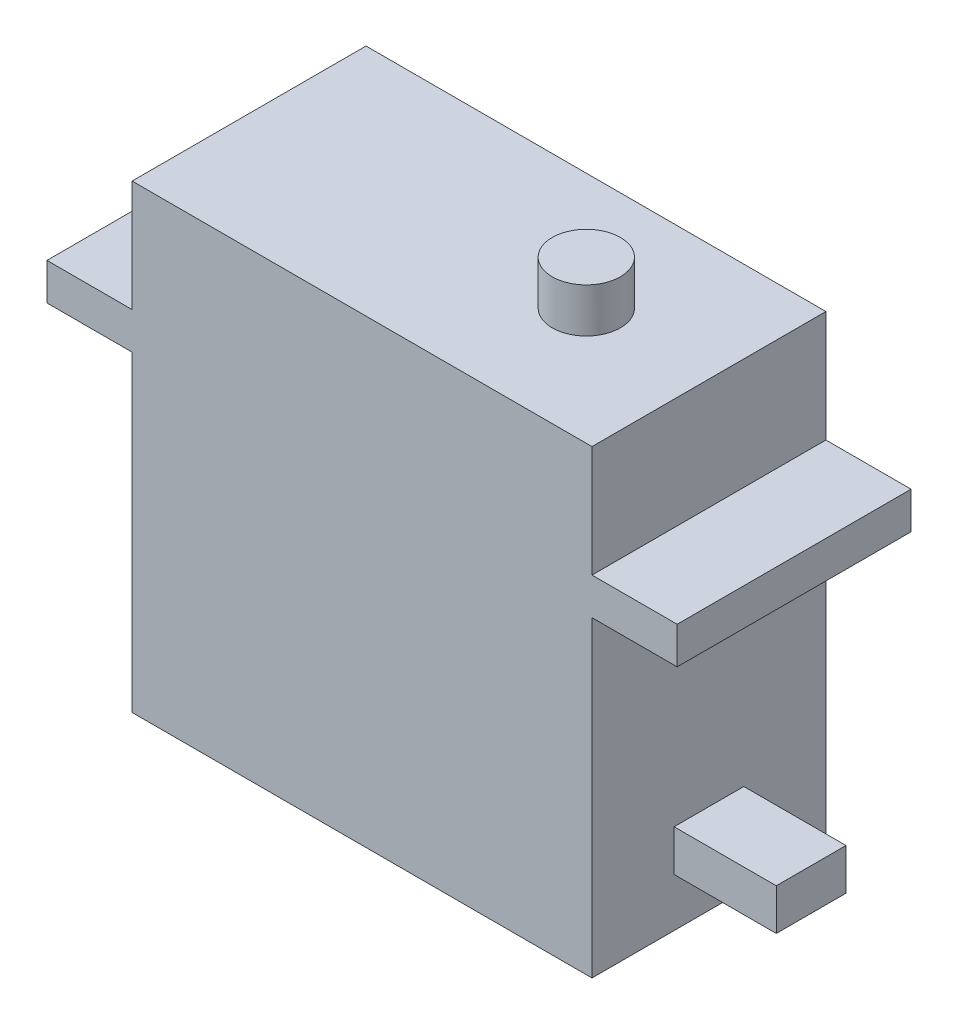
ISO-10303-21;
HEADER;
FILE_DESCRIPTION(('STEP AP214'),'2;1');
FILE_NAME('part.step','',(''),(''),'','','');
FILE_SCHEMA(('AUTOMOTIVE_DESIGN { 1 0 10303 214 1 1 1 1 }'));
ENDSEC;
DATA;
#1=APPLICATION_CONTEXT('core data for automotive mechanical design processes');
#2=APPLICATION_PROTOCOL_DEFINITION('international standard','automotive_design',2000,#1);
#3=PRODUCT_CONTEXT('',#1,'mechanical');
#4=PRODUCT('Part','Part','',(#3));
#5=PRODUCT_RELATED_PRODUCT_CATEGORY('part','',(#4));
#6=PRODUCT_DEFINITION_FORMATION('','',#4);
#7=PRODUCT_DEFINITION_CONTEXT('part definition',#1,'design');
#8=PRODUCT_DEFINITION('design','',#6,#7);
#9=PRODUCT_DEFINITION_SHAPE('','',#8);
#10=(LENGTH_UNIT() NAMED_UNIT(*) SI_UNIT(.MILLI.,.METRE.));
#11=(NAMED_UNIT(*) PLANE_ANGLE_UNIT() SI_UNIT($,.RADIAN.));
#12=(NAMED_UNIT(*) SI_UNIT($,.STERADIAN.) SOLID_ANGLE_UNIT());
#13=UNCERTAINTY_MEASURE_WITH_UNIT(LENGTH_MEASURE(1.E-05),#10,'distance_accuracy_value','');
#14=(GEOMETRIC_REPRESENTATION_CONTEXT(3) GLOBAL_UNCERTAINTY_ASSIGNED_CONTEXT((#13)) GLOBAL_UNIT_ASSIGNED_CONTEXT((#10,
#11,#12)) REPRESENTATION_CONTEXT('',''));
#15=CARTESIAN_POINT('',(0.,0.,0.));
#16=DIRECTION('',(0.,0.,1.));
#17=DIRECTION('',(1.,0.,0.));
#18=AXIS2_PLACEMENT_3D('',#15,#16,#17);
#19=CARTESIAN_POINT('',(20.25,-20.265,20.6));
#20=DIRECTION('',(-1.,0.,0.));
#21=DIRECTION('',(0.,0.,1.));
#22=AXIS2_PLACEMENT_3D('',#19,#20,#21);
#23=PLANE('',#22);
#24=DIRECTION('',(0.,1.,0.));
#25=VECTOR('',#24,1.);
#26=CARTESIAN_POINT('',(20.25,-20.265,0.));
#27=LINE('',#26,#25);
#28=CARTESIAN_POINT('',(20.25,-20.265,0.));
#29=VERTEX_POINT('',#28);
#30=CARTESIAN_POINT('',(20.25,7.215,0.));
#31=VERTEX_POINT('',#30);
#32=EDGE_CURVE('E248',#29,#31,#27,.T.);
#33=ORIENTED_EDGE('',*,*,#32,.T.);
#34=DIRECTION('',(0.,0.,1.));
#35=VECTOR('',#34,1.);
#36=CARTESIAN_POINT('',(20.25,7.215,20.6));
#37=LINE('',#36,#35);
#38=CARTESIAN_POINT('',(20.25,7.215,20.6));
#39=VERTEX_POINT('',#38);
#40=EDGE_CURVE('E188',#31,#39,#37,.T.);
#41=ORIENTED_EDGE('',*,*,#40,.T.);
#42=DIRECTION('',(0.,1.,0.));
#43=VECTOR('',#42,1.);
#44=CARTESIAN_POINT('',(20.25,-20.265,20.6));
#45=LINE('',#44,#43);
#46=CARTESIAN_POINT('',(20.25,-20.265,20.6));
#47=VERTEX_POINT('',#46);
#48=EDGE_CURVE('E235',#47,#39,#45,.T.);
#49=ORIENTED_EDGE('',*,*,#48,.F.);
#50=DIRECTION('',(0.,0.,-1.));
#51=VECTOR('',#50,1.);
#52=CARTESIAN_POINT('',(20.25,-20.265,20.6));
#53=LINE('',#52,#51);
#54=EDGE_CURVE('E247',#47,#29,#53,.T.);
#55=ORIENTED_EDGE('',*,*,#54,.T.);
#56=EDGE_LOOP('',(#33,#41,#49,#55));
#57=FACE_BOUND('',#56,.T.);
#58=DIRECTION('',(0.,1.,0.));
#59=VECTOR('',#58,1.);
#60=CARTESIAN_POINT('',(20.25,-15.985,7.23));
#61=LINE('',#60,#59);
#62=CARTESIAN_POINT('',(20.25,-15.985,7.23));
#63=VERTEX_POINT('',#62);
#64=CARTESIAN_POINT('',(20.25,-12.345,7.23));
#65=VERTEX_POINT('',#64);
#66=EDGE_CURVE('E171',#63,#65,#61,.T.);
#67=ORIENTED_EDGE('',*,*,#66,.F.);
#68=DIRECTION('',(0.,0.,-1.));
#69=VECTOR('',#68,1.);
#70=CARTESIAN_POINT('',(20.25,-15.985,13.37));
#71=LINE('',#70,#69);
#72=CARTESIAN_POINT('',(20.25,-15.985,13.37));
#73=VERTEX_POINT('',#72);
#74=EDGE_CURVE('E168',#73,#63,#71,.T.);
#75=ORIENTED_EDGE('',*,*,#74,.F.);
#76=DIRECTION('',(0.,-1.,0.));
#77=VECTOR('',#76,1.);
#78=CARTESIAN_POINT('',(20.25,-15.985,13.37));
#79=LINE('',#78,#77);
#80=CARTESIAN_POINT('',(20.25,-12.345,13.37));
#81=VERTEX_POINT('',#80);
#82=EDGE_CURVE('E58',#81,#73,#79,.T.);
#83=ORIENTED_EDGE('',*,*,#82,.F.);
#84=DIRECTION('',(0.,0.,1.));
#85=VECTOR('',#84,1.);
#86=CARTESIAN_POINT('',(20.25,-12.345,13.37));
#87=LINE('',#86,#85);
#88=EDGE_CURVE('E53',#65,#81,#87,.T.);
#89=ORIENTED_EDGE('',*,*,#88,.F.);
#90=EDGE_LOOP('',(#67,#75,#83,#89));
#91=FACE_BOUND('',#90,.T.);
#92=ADVANCED_FACE('F39',(#57,#91),#23,.F.);
#93=DIRECTION('',(0.,0.,1.));
#94=VECTOR('',#93,1.);
#95=CARTESIAN_POINT('',(20.25,10.465,20.6));
#96=LINE('',#95,#94);
#97=CARTESIAN_POINT('',(20.25,10.465,0.));
#98=VERTEX_POINT('',#97);
#99=CARTESIAN_POINT('',(20.25,10.465,20.6));
#100=VERTEX_POINT('',#99);
#101=EDGE_CURVE('E194',#98,#100,#96,.T.);
#102=ORIENTED_EDGE('',*,*,#101,.F.);
#103=CARTESIAN_POINT('',(20.25,20.265,0.));
#104=VERTEX_POINT('',#103);
#105=EDGE_CURVE('E233',#98,#104,#27,.T.);
#106=ORIENTED_EDGE('',*,*,#105,.T.);
#107=DIRECTION('',(0.,0.,-1.));
#108=VECTOR('',#107,1.);
#109=CARTESIAN_POINT('',(20.25,20.265,20.6));
#110=LINE('',#109,#108);
#111=CARTESIAN_POINT('',(20.25,20.265,20.6));
#112=VERTEX_POINT('',#111);
#113=EDGE_CURVE('E46',#112,#104,#110,.T.);
#114=ORIENTED_EDGE('',*,*,#113,.F.);
#115=EDGE_CURVE('E239',#100,#112,#45,.T.);
#116=ORIENTED_EDGE('',*,*,#115,.F.);
#117=EDGE_LOOP('',(#102,#106,#114,#116));
#118=FACE_BOUND('',#117,.T.);
#119=ADVANCED_FACE('F276',(#118),#23,.F.);
#120=CARTESIAN_POINT('',(-20.25,-20.265,20.6));
#121=DIRECTION('',(1.,0.,0.));
#122=DIRECTION('',(0.,0.,-1.));
#123=AXIS2_PLACEMENT_3D('',#120,#121,#122);
#124=PLANE('',#123);
#125=DIRECTION('',(0.,0.,-1.));
#126=VECTOR('',#125,1.);
#127=CARTESIAN_POINT('',(-20.25,10.465,20.6));
#128=LINE('',#127,#126);
#129=CARTESIAN_POINT('',(-20.25,10.465,20.6));
#130=VERTEX_POINT('',#129);
#131=CARTESIAN_POINT('',(-20.25,10.465,0.));
#132=VERTEX_POINT('',#131);
#133=EDGE_CURVE('E197',#130,#132,#128,.T.);
#134=ORIENTED_EDGE('',*,*,#133,.F.);
#135=DIRECTION('',(0.,-1.,0.));
#136=VECTOR('',#135,1.);
#137=CARTESIAN_POINT('',(-20.25,-20.265,20.6));
#138=LINE('',#137,#136);
#139=CARTESIAN_POINT('',(-20.25,20.265,20.6));
#140=VERTEX_POINT('',#139);
#141=EDGE_CURVE('E242',#140,#130,#138,.T.);
#142=ORIENTED_EDGE('',*,*,#141,.F.);
#143=DIRECTION('',(0.,0.,-1.));
#144=VECTOR('',#143,1.);
#145=CARTESIAN_POINT('',(-20.25,20.265,20.6));
#146=LINE('',#145,#144);
#147=CARTESIAN_POINT('',(-20.25,20.265,0.));
#148=VERTEX_POINT('',#147);
#149=EDGE_CURVE('E264',#140,#148,#146,.T.);
#150=ORIENTED_EDGE('',*,*,#149,.T.);
#151=DIRECTION('',(0.,-1.,0.));
#152=VECTOR('',#151,1.);
#153=CARTESIAN_POINT('',(-20.25,-20.265,0.));
#154=LINE('',#153,#152);
#155=EDGE_CURVE('E254',#148,#132,#154,.T.);
#156=ORIENTED_EDGE('',*,*,#155,.T.);
#157=EDGE_LOOP('',(#134,#142,#150,#156));
#158=FACE_BOUND('',#157,.T.);
#159=ADVANCED_FACE('F285',(#158),#124,.F.);
#160=CARTESIAN_POINT('',(-20.25,20.265,20.6));
#161=DIRECTION('',(0.,-1.,0.));
#162=DIRECTION('',(0.,0.,-1.));
#163=AXIS2_PLACEMENT_3D('',#160,#161,#162);
#164=PLANE('',#163);
#165=CARTESIAN_POINT('',(9.45,20.265,10.3));
#166=DIRECTION('',(0.,-1.,0.));
#167=DIRECTION('',(0.,0.,-1.));
#168=AXIS2_PLACEMENT_3D('',#165,#166,#167);
#169=CIRCLE('',#168,3.);
#170=CARTESIAN_POINT('',(9.45,20.265,7.3));
#171=VERTEX_POINT('',#170);
#172=EDGE_CURVE('E11',#171,#171,#169,.F.);
#173=ORIENTED_EDGE('',*,*,#172,.F.);
#174=EDGE_LOOP('',(#173));
#175=FACE_BOUND('',#174,.T.);
#176=DIRECTION('',(-1.,0.,0.));
#177=VECTOR('',#176,1.);
#178=CARTESIAN_POINT('',(-20.25,20.265,0.));
#179=LINE('',#178,#177);
#180=EDGE_CURVE('E251',#104,#148,#179,.T.);
#181=ORIENTED_EDGE('',*,*,#180,.T.);
#182=ORIENTED_EDGE('',*,*,#149,.F.);
#183=DIRECTION('',(-1.,0.,0.));
#184=VECTOR('',#183,1.);
#185=CARTESIAN_POINT('',(-20.25,20.265,20.6));
#186=LINE('',#185,#184);
#187=EDGE_CURVE('E238',#112,#140,#186,.T.);
#188=ORIENTED_EDGE('',*,*,#187,.F.);
#189=ORIENTED_EDGE('',*,*,#113,.T.);
#190=EDGE_LOOP('',(#181,#182,#188,#189));
#191=FACE_BOUND('',#190,.T.);
#192=ADVANCED_FACE('F270',(#175,#191),#164,.F.);
#193=CARTESIAN_POINT('',(-20.25,7.215,20.6));
#194=VERTEX_POINT('',#193);
#195=CARTESIAN_POINT('',(-20.25,-20.265,20.6));
#196=VERTEX_POINT('',#195);
#197=EDGE_CURVE('E241',#194,#196,#138,.T.);
#198=ORIENTED_EDGE('',*,*,#197,.F.);
#199=DIRECTION('',(0.,0.,-1.));
#200=VECTOR('',#199,1.);
#201=CARTESIAN_POINT('',(-20.25,7.215,20.6));
#202=LINE('',#201,#200);
#203=CARTESIAN_POINT('',(-20.25,7.215,0.));
#204=VERTEX_POINT('',#203);
#205=EDGE_CURVE('E208',#194,#204,#202,.T.);
#206=ORIENTED_EDGE('',*,*,#205,.T.);
#207=CARTESIAN_POINT('',(-20.25,-20.265,0.));
#208=VERTEX_POINT('',#207);
#209=EDGE_CURVE('E253',#204,#208,#154,.T.);
#210=ORIENTED_EDGE('',*,*,#209,.T.);
#211=DIRECTION('',(0.,0.,-1.));
#212=VECTOR('',#211,1.);
#213=CARTESIAN_POINT('',(-20.25,-20.265,20.6));
#214=LINE('',#213,#212);
#215=EDGE_CURVE('E261',#196,#208,#214,.T.);
#216=ORIENTED_EDGE('',*,*,#215,.F.);
#217=EDGE_LOOP('',(#198,#206,#210,#216));
#218=FACE_BOUND('',#217,.T.);
#219=ADVANCED_FACE('F310',(#218),#124,.F.);
#220=CARTESIAN_POINT('',(-20.25,-20.265,20.6));
#221=DIRECTION('',(0.,1.,0.));
#222=DIRECTION('',(0.,0.,1.));
#223=AXIS2_PLACEMENT_3D('',#220,#221,#222);
#224=PLANE('',#223);
#225=DIRECTION('',(1.,0.,0.));
#226=VECTOR('',#225,1.);
#227=CARTESIAN_POINT('',(-20.25,-20.265,0.));
#228=LINE('',#227,#226);
#229=EDGE_CURVE('E257',#208,#29,#228,.T.);
#230=ORIENTED_EDGE('',*,*,#229,.T.);
#231=ORIENTED_EDGE('',*,*,#54,.F.);
#232=DIRECTION('',(1.,0.,0.));
#233=VECTOR('',#232,1.);
#234=CARTESIAN_POINT('',(-20.25,-20.265,20.6));
#235=LINE('',#234,#233);
#236=EDGE_CURVE('E245',#196,#47,#235,.T.);
#237=ORIENTED_EDGE('',*,*,#236,.F.);
#238=ORIENTED_EDGE('',*,*,#215,.T.);
#239=EDGE_LOOP('',(#230,#231,#237,#238));
#240=FACE_BOUND('',#239,.T.);
#241=ADVANCED_FACE('F306',(#240),#224,.F.);
#242=CARTESIAN_POINT('',(0.,0.,20.6));
#243=DIRECTION('',(0.,0.,-1.));
#244=DIRECTION('',(-1.,0.,0.));
#245=AXIS2_PLACEMENT_3D('',#242,#243,#244);
#246=PLANE('',#245);
#247=ORIENTED_EDGE('',*,*,#48,.T.);
#248=DIRECTION('',(1.,0.,0.));
#249=VECTOR('',#248,1.);
#250=CARTESIAN_POINT('',(20.25,7.215,20.6));
#251=LINE('',#250,#249);
#252=CARTESIAN_POINT('',(27.75,7.215,20.6));
#253=VERTEX_POINT('',#252);
#254=EDGE_CURVE('E203',#39,#253,#251,.T.);
#255=ORIENTED_EDGE('',*,*,#254,.T.);
#256=DIRECTION('',(0.,1.,0.));
#257=VECTOR('',#256,1.);
#258=CARTESIAN_POINT('',(27.75,7.215,20.6));
#259=LINE('',#258,#257);
#260=CARTESIAN_POINT('',(27.75,10.465,20.6));
#261=VERTEX_POINT('',#260);
#262=EDGE_CURVE('E181',#253,#261,#259,.T.);
#263=ORIENTED_EDGE('',*,*,#262,.T.);
#264=DIRECTION('',(1.,0.,0.));
#265=VECTOR('',#264,1.);
#266=CARTESIAN_POINT('',(20.25,10.465,20.6));
#267=LINE('',#266,#265);
#268=EDGE_CURVE('E191',#100,#261,#267,.T.);
#269=ORIENTED_EDGE('',*,*,#268,.F.);
#270=ORIENTED_EDGE('',*,*,#115,.T.);
#271=ORIENTED_EDGE('',*,*,#187,.T.);
#272=ORIENTED_EDGE('',*,*,#141,.T.);
#273=DIRECTION('',(1.,0.,0.));
#274=VECTOR('',#273,1.);
#275=CARTESIAN_POINT('',(-20.25,10.465,20.6));
#276=LINE('',#275,#274);
#277=CARTESIAN_POINT('',(-27.75,10.465,20.6));
#278=VERTEX_POINT('',#277);
#279=EDGE_CURVE('E212',#278,#130,#276,.T.);
#280=ORIENTED_EDGE('',*,*,#279,.F.);
#281=DIRECTION('',(0.,1.,0.));
#282=VECTOR('',#281,1.);
#283=CARTESIAN_POINT('',(-27.75,7.215,20.6));
#284=LINE('',#283,#282);
#285=CARTESIAN_POINT('',(-27.75,7.215,20.6));
#286=VERTEX_POINT('',#285);
#287=EDGE_CURVE('E231',#286,#278,#284,.T.);
#288=ORIENTED_EDGE('',*,*,#287,.F.);
#289=DIRECTION('',(1.,0.,0.));
#290=VECTOR('',#289,1.);
#291=CARTESIAN_POINT('',(-20.25,7.215,20.6));
#292=LINE('',#291,#290);
#293=EDGE_CURVE('E218',#286,#194,#292,.T.);
#294=ORIENTED_EDGE('',*,*,#293,.T.);
#295=ORIENTED_EDGE('',*,*,#197,.T.);
#296=ORIENTED_EDGE('',*,*,#236,.T.);
#297=EDGE_LOOP('',(#247,#255,#263,#269,#270,#271,#272,#280,#288,#294,#295,#296));
#298=FACE_BOUND('',#297,.T.);
#299=ADVANCED_FACE('F289',(#298),#246,.F.);
#300=CARTESIAN_POINT('',(0.,0.,0.));
#301=DIRECTION('',(0.,0.,-1.));
#302=DIRECTION('',(-1.,0.,0.));
#303=AXIS2_PLACEMENT_3D('',#300,#301,#302);
#304=PLANE('',#303);
#305=ORIENTED_EDGE('',*,*,#32,.F.);
#306=ORIENTED_EDGE('',*,*,#229,.F.);
#307=ORIENTED_EDGE('',*,*,#209,.F.);
#308=DIRECTION('',(-1.,0.,0.));
#309=VECTOR('',#308,1.);
#310=CARTESIAN_POINT('',(-20.25,7.215,0.));
#311=LINE('',#310,#309);
#312=CARTESIAN_POINT('',(-27.75,7.215,0.));
#313=VERTEX_POINT('',#312);
#314=EDGE_CURVE('E211',#204,#313,#311,.T.);
#315=ORIENTED_EDGE('',*,*,#314,.T.);
#316=DIRECTION('',(0.,1.,0.));
#317=VECTOR('',#316,1.);
#318=CARTESIAN_POINT('',(-27.75,7.215,0.));
#319=LINE('',#318,#317);
#320=CARTESIAN_POINT('',(-27.75,10.465,0.));
#321=VERTEX_POINT('',#320);
#322=EDGE_CURVE('E221',#313,#321,#319,.T.);
#323=ORIENTED_EDGE('',*,*,#322,.T.);
#324=DIRECTION('',(-1.,0.,0.));
#325=VECTOR('',#324,1.);
#326=CARTESIAN_POINT('',(-20.25,10.465,0.));
#327=LINE('',#326,#325);
#328=EDGE_CURVE('E224',#132,#321,#327,.T.);
#329=ORIENTED_EDGE('',*,*,#328,.F.);
#330=ORIENTED_EDGE('',*,*,#155,.F.);
#331=ORIENTED_EDGE('',*,*,#180,.F.);
#332=ORIENTED_EDGE('',*,*,#105,.F.);
#333=DIRECTION('',(-1.,0.,0.));
#334=VECTOR('',#333,1.);
#335=CARTESIAN_POINT('',(20.25,10.465,0.));
#336=LINE('',#335,#334);
#337=CARTESIAN_POINT('',(27.75,10.465,0.));
#338=VERTEX_POINT('',#337);
#339=EDGE_CURVE('E185',#338,#98,#336,.T.);
#340=ORIENTED_EDGE('',*,*,#339,.F.);
#341=DIRECTION('',(0.,1.,0.));
#342=VECTOR('',#341,1.);
#343=CARTESIAN_POINT('',(27.75,7.215,0.));
#344=LINE('',#343,#342);
#345=CARTESIAN_POINT('',(27.75,7.215,0.));
#346=VERTEX_POINT('',#345);
#347=EDGE_CURVE('E175',#346,#338,#344,.T.);
#348=ORIENTED_EDGE('',*,*,#347,.F.);
#349=DIRECTION('',(-1.,0.,0.));
#350=VECTOR('',#349,1.);
#351=CARTESIAN_POINT('',(20.25,7.215,0.));
#352=LINE('',#351,#350);
#353=EDGE_CURVE('E183',#346,#31,#352,.T.);
#354=ORIENTED_EDGE('',*,*,#353,.T.);
#355=EDGE_LOOP('',(#305,#306,#307,#315,#323,#329,#330,#331,#332,#340,#348,#354));
#356=FACE_BOUND('',#355,.T.);
#357=ADVANCED_FACE('F282',(#356),#304,.T.);
#358=CARTESIAN_POINT('',(-27.75,7.215,20.6));
#359=DIRECTION('',(-1.,0.,0.));
#360=DIRECTION('',(0.,0.,1.));
#361=AXIS2_PLACEMENT_3D('',#358,#359,#360);
#362=PLANE('',#361);
#363=DIRECTION('',(0.,0.,1.));
#364=VECTOR('',#363,1.);
#365=CARTESIAN_POINT('',(-27.75,10.465,20.6));
#366=LINE('',#365,#364);
#367=EDGE_CURVE('E227',#321,#278,#366,.T.);
#368=ORIENTED_EDGE('',*,*,#367,.F.);
#369=ORIENTED_EDGE('',*,*,#322,.F.);
#370=DIRECTION('',(0.,0.,1.));
#371=VECTOR('',#370,1.);
#372=CARTESIAN_POINT('',(-27.75,7.215,20.6));
#373=LINE('',#372,#371);
#374=EDGE_CURVE('E215',#313,#286,#373,.T.);
#375=ORIENTED_EDGE('',*,*,#374,.T.);
#376=ORIENTED_EDGE('',*,*,#287,.T.);
#377=EDGE_LOOP('',(#368,#369,#375,#376));
#378=FACE_BOUND('',#377,.T.);
#379=ADVANCED_FACE('F317',(#378),#362,.T.);
#380=CARTESIAN_POINT('',(0.,7.215,0.));
#381=DIRECTION('',(0.,1.,0.));
#382=DIRECTION('',(0.,0.,1.));
#383=AXIS2_PLACEMENT_3D('',#380,#381,#382);
#384=PLANE('',#383);
#385=ORIENTED_EDGE('',*,*,#205,.F.);
#386=ORIENTED_EDGE('',*,*,#293,.F.);
#387=ORIENTED_EDGE('',*,*,#374,.F.);
#388=ORIENTED_EDGE('',*,*,#314,.F.);
#389=EDGE_LOOP('',(#385,#386,#387,#388));
#390=FACE_BOUND('',#389,.T.);
#391=ADVANCED_FACE('F313',(#390),#384,.F.);
#392=CARTESIAN_POINT('',(0.,10.465,0.));
#393=DIRECTION('',(0.,1.,0.));
#394=DIRECTION('',(0.,0.,1.));
#395=AXIS2_PLACEMENT_3D('',#392,#393,#394);
#396=PLANE('',#395);
#397=ORIENTED_EDGE('',*,*,#133,.T.);
#398=ORIENTED_EDGE('',*,*,#328,.T.);
#399=ORIENTED_EDGE('',*,*,#367,.T.);
#400=ORIENTED_EDGE('',*,*,#279,.T.);
#401=EDGE_LOOP('',(#397,#398,#399,#400));
#402=FACE_BOUND('',#401,.T.);
#403=ADVANCED_FACE('F319',(#402),#396,.T.);
#404=CARTESIAN_POINT('',(27.75,7.215,20.6));
#405=DIRECTION('',(1.,0.,0.));
#406=DIRECTION('',(0.,0.,-1.));
#407=AXIS2_PLACEMENT_3D('',#404,#405,#406);
#408=PLANE('',#407);
#409=DIRECTION('',(0.,0.,-1.));
#410=VECTOR('',#409,1.);
#411=CARTESIAN_POINT('',(27.75,10.465,20.6));
#412=LINE('',#411,#410);
#413=EDGE_CURVE('E187',#261,#338,#412,.T.);
#414=ORIENTED_EDGE('',*,*,#413,.F.);
#415=ORIENTED_EDGE('',*,*,#262,.F.);
#416=DIRECTION('',(0.,0.,-1.));
#417=VECTOR('',#416,1.);
#418=CARTESIAN_POINT('',(27.75,7.215,20.6));
#419=LINE('',#418,#417);
#420=EDGE_CURVE('E200',#253,#346,#419,.T.);
#421=ORIENTED_EDGE('',*,*,#420,.T.);
#422=ORIENTED_EDGE('',*,*,#347,.T.);
#423=EDGE_LOOP('',(#414,#415,#421,#422));
#424=FACE_BOUND('',#423,.T.);
#425=ADVANCED_FACE('F296',(#424),#408,.T.);
#426=CARTESIAN_POINT('',(0.,7.215,0.));
#427=DIRECTION('',(0.,-1.,0.));
#428=DIRECTION('',(0.,0.,-1.));
#429=AXIS2_PLACEMENT_3D('',#426,#427,#428);
#430=PLANE('',#429);
#431=ORIENTED_EDGE('',*,*,#40,.F.);
#432=ORIENTED_EDGE('',*,*,#353,.F.);
#433=ORIENTED_EDGE('',*,*,#420,.F.);
#434=ORIENTED_EDGE('',*,*,#254,.F.);
#435=EDGE_LOOP('',(#431,#432,#433,#434));
#436=FACE_BOUND('',#435,.T.);
#437=ADVANCED_FACE('F298',(#436),#430,.T.);
#438=CARTESIAN_POINT('',(0.,10.465,0.));
#439=DIRECTION('',(0.,-1.,0.));
#440=DIRECTION('',(0.,0.,-1.));
#441=AXIS2_PLACEMENT_3D('',#438,#439,#440);
#442=PLANE('',#441);
#443=ORIENTED_EDGE('',*,*,#101,.T.);
#444=ORIENTED_EDGE('',*,*,#268,.T.);
#445=ORIENTED_EDGE('',*,*,#413,.T.);
#446=ORIENTED_EDGE('',*,*,#339,.T.);
#447=EDGE_LOOP('',(#443,#444,#445,#446));
#448=FACE_BOUND('',#447,.T.);
#449=ADVANCED_FACE('F292',(#448),#442,.F.);
#450=CARTESIAN_POINT('',(9.45,24.165,10.3));
#451=DIRECTION('',(0.,-1.,0.));
#452=DIRECTION('',(0.,0.,-1.));
#453=AXIS2_PLACEMENT_3D('',#450,#451,#452);
#454=CYLINDRICAL_SURFACE('',#453,3.);
#455=CARTESIAN_POINT('',(9.45,24.165,10.3));
#456=DIRECTION('',(0.,1.,0.));
#457=DIRECTION('',(0.,0.,1.));
#458=AXIS2_PLACEMENT_3D('',#455,#456,#457);
#459=CIRCLE('',#458,3.);
#460=CARTESIAN_POINT('',(9.45,24.165,13.3));
#461=VERTEX_POINT('',#460);
#462=EDGE_CURVE('E172',#461,#461,#459,.T.);
#463=ORIENTED_EDGE('',*,*,#462,.F.);
#464=EDGE_LOOP('',(#463));
#465=FACE_BOUND('',#464,.T.);
#466=ORIENTED_EDGE('',*,*,#172,.T.);
#467=EDGE_LOOP('',(#466));
#468=FACE_BOUND('',#467,.T.);
#469=ADVANCED_FACE('F392',(#465,#468),#454,.T.);
#470=CARTESIAN_POINT('',(9.45,24.165,10.3));
#471=DIRECTION('',(0.,1.,0.));
#472=DIRECTION('',(0.,0.,1.));
#473=AXIS2_PLACEMENT_3D('',#470,#471,#472);
#474=PLANE('',#473);
#475=ORIENTED_EDGE('',*,*,#462,.T.);
#476=EDGE_LOOP('',(#475));
#477=FACE_BOUND('',#476,.T.);
#478=ADVANCED_FACE('F401',(#477),#474,.T.);
#479=CARTESIAN_POINT('',(29.25,-15.985,7.23));
#480=DIRECTION('',(0.,0.,1.));
#481=DIRECTION('',(1.,0.,0.));
#482=AXIS2_PLACEMENT_3D('',#479,#480,#481);
#483=PLANE('',#482);
#484=ORIENTED_EDGE('',*,*,#66,.T.);
#485=DIRECTION('',(-1.,0.,0.));
#486=VECTOR('',#485,1.);
#487=CARTESIAN_POINT('',(29.25,-12.345,7.23));
#488=LINE('',#487,#486);
#489=CARTESIAN_POINT('',(29.25,-12.345,7.23));
#490=VERTEX_POINT('',#489);
#491=EDGE_CURVE('E152',#490,#65,#488,.T.);
#492=ORIENTED_EDGE('',*,*,#491,.F.);
#493=DIRECTION('',(0.,1.,0.));
#494=VECTOR('',#493,1.);
#495=CARTESIAN_POINT('',(29.25,-15.985,7.23));
#496=LINE('',#495,#494);
#497=CARTESIAN_POINT('',(29.25,-15.985,7.23));
#498=VERTEX_POINT('',#497);
#499=EDGE_CURVE('E159',#498,#490,#496,.T.);
#500=ORIENTED_EDGE('',*,*,#499,.F.);
#501=DIRECTION('',(-1.,0.,0.));
#502=VECTOR('',#501,1.);
#503=CARTESIAN_POINT('',(29.25,-15.985,7.23));
#504=LINE('',#503,#502);
#505=EDGE_CURVE('E462',#498,#63,#504,.T.);
#506=ORIENTED_EDGE('',*,*,#505,.T.);
#507=EDGE_LOOP('',(#484,#492,#500,#506));
#508=FACE_BOUND('',#507,.T.);
#509=ADVANCED_FACE('F170',(#508),#483,.F.);
#510=CARTESIAN_POINT('',(29.25,-12.345,13.37));
#511=DIRECTION('',(0.,-1.,0.));
#512=DIRECTION('',(0.,0.,-1.));
#513=AXIS2_PLACEMENT_3D('',#510,#511,#512);
#514=PLANE('',#513);
#515=ORIENTED_EDGE('',*,*,#88,.T.);
#516=DIRECTION('',(-1.,0.,0.));
#517=VECTOR('',#516,1.);
#518=CARTESIAN_POINT('',(29.25,-12.345,13.37));
#519=LINE('',#518,#517);
#520=CARTESIAN_POINT('',(29.25,-12.345,13.37));
#521=VERTEX_POINT('',#520);
#522=EDGE_CURVE('E155',#521,#81,#519,.T.);
#523=ORIENTED_EDGE('',*,*,#522,.F.);
#524=DIRECTION('',(0.,0.,1.));
#525=VECTOR('',#524,1.);
#526=CARTESIAN_POINT('',(29.25,-12.345,13.37));
#527=LINE('',#526,#525);
#528=EDGE_CURVE('E148',#490,#521,#527,.T.);
#529=ORIENTED_EDGE('',*,*,#528,.F.);
#530=ORIENTED_EDGE('',*,*,#491,.T.);
#531=EDGE_LOOP('',(#515,#523,#529,#530));
#532=FACE_BOUND('',#531,.T.);
#533=ADVANCED_FACE('F150',(#532),#514,.F.);
#534=CARTESIAN_POINT('',(29.25,-15.985,13.37));
#535=DIRECTION('',(0.,0.,-1.));
#536=DIRECTION('',(-1.,0.,0.));
#537=AXIS2_PLACEMENT_3D('',#534,#535,#536);
#538=PLANE('',#537);
#539=ORIENTED_EDGE('',*,*,#82,.T.);
#540=DIRECTION('',(-1.,0.,0.));
#541=VECTOR('',#540,1.);
#542=CARTESIAN_POINT('',(29.25,-15.985,13.37));
#543=LINE('',#542,#541);
#544=CARTESIAN_POINT('',(29.25,-15.985,13.37));
#545=VERTEX_POINT('',#544);
#546=EDGE_CURVE('E177',#545,#73,#543,.T.);
#547=ORIENTED_EDGE('',*,*,#546,.F.);
#548=DIRECTION('',(0.,-1.,0.));
#549=VECTOR('',#548,1.);
#550=CARTESIAN_POINT('',(29.25,-15.985,13.37));
#551=LINE('',#550,#549);
#552=EDGE_CURVE('E158',#521,#545,#551,.T.);
#553=ORIENTED_EDGE('',*,*,#552,.F.);
#554=ORIENTED_EDGE('',*,*,#522,.T.);
#555=EDGE_LOOP('',(#539,#547,#553,#554));
#556=FACE_BOUND('',#555,.T.);
#557=ADVANCED_FACE('F430',(#556),#538,.F.);
#558=CARTESIAN_POINT('',(29.25,-15.985,13.37));
#559=DIRECTION('',(0.,1.,0.));
#560=DIRECTION('',(0.,0.,1.));
#561=AXIS2_PLACEMENT_3D('',#558,#559,#560);
#562=PLANE('',#561);
#563=ORIENTED_EDGE('',*,*,#74,.T.);
#564=ORIENTED_EDGE('',*,*,#505,.F.);
#565=DIRECTION('',(0.,0.,-1.));
#566=VECTOR('',#565,1.);
#567=CARTESIAN_POINT('',(29.25,-15.985,13.37));
#568=LINE('',#567,#566);
#569=EDGE_CURVE('E164',#545,#498,#568,.T.);
#570=ORIENTED_EDGE('',*,*,#569,.F.);
#571=ORIENTED_EDGE('',*,*,#546,.T.);
#572=EDGE_LOOP('',(#563,#564,#570,#571));
#573=FACE_BOUND('',#572,.T.);
#574=ADVANCED_FACE('F439',(#573),#562,.F.);
#575=CARTESIAN_POINT('',(29.25,0.,0.));
#576=DIRECTION('',(-1.,0.,0.));
#577=DIRECTION('',(0.,0.,1.));
#578=AXIS2_PLACEMENT_3D('',#575,#576,#577);
#579=PLANE('',#578);
#580=ORIENTED_EDGE('',*,*,#499,.T.);
#581=ORIENTED_EDGE('',*,*,#528,.T.);
#582=ORIENTED_EDGE('',*,*,#552,.T.);
#583=ORIENTED_EDGE('',*,*,#569,.T.);
#584=EDGE_LOOP('',(#580,#581,#582,#583));
#585=FACE_BOUND('',#584,.T.);
#586=ADVANCED_FACE('F162',(#585),#579,.F.);
#587=CLOSED_SHELL('',(#92,#119,#159,#192,#219,#241,#299,#357,#379,#391,#403,#425,#437,#449,#469,
#478,#509,#533,#557,#574,#586));
#588=MANIFOLD_SOLID_BREP('B2',#587);
#589=ADVANCED_BREP_SHAPE_REPRESENTATION('',(#18,#588),#14);
#590=SHAPE_DEFINITION_REPRESENTATION(#9,#589);
ENDSEC;
END-ISO-10303-21;
